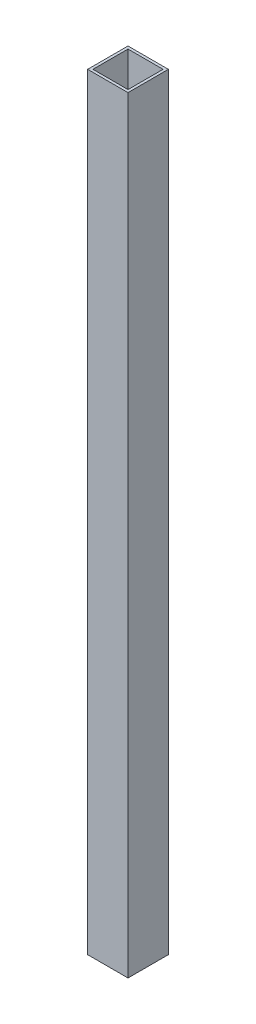
ISO-10303-21;
HEADER;
FILE_DESCRIPTION(('STEP AP214'),'2;1');
FILE_NAME('part.step','',(''),(''),'','','');
FILE_SCHEMA(('AUTOMOTIVE_DESIGN { 1 0 10303 214 1 1 1 1 }'));
ENDSEC;
DATA;
#1=APPLICATION_CONTEXT('core data for automotive mechanical design processes');
#2=APPLICATION_PROTOCOL_DEFINITION('international standard','automotive_design',2000,#1);
#3=PRODUCT_CONTEXT('',#1,'mechanical');
#4=PRODUCT('Part','Part','',(#3));
#5=PRODUCT_RELATED_PRODUCT_CATEGORY('part','',(#4));
#6=PRODUCT_DEFINITION_FORMATION('','',#4);
#7=PRODUCT_DEFINITION_CONTEXT('part definition',#1,'design');
#8=PRODUCT_DEFINITION('design','',#6,#7);
#9=PRODUCT_DEFINITION_SHAPE('','',#8);
#10=(LENGTH_UNIT() NAMED_UNIT(*) SI_UNIT(.MILLI.,.METRE.));
#11=(NAMED_UNIT(*) PLANE_ANGLE_UNIT() SI_UNIT($,.RADIAN.));
#12=(NAMED_UNIT(*) SI_UNIT($,.STERADIAN.) SOLID_ANGLE_UNIT());
#13=UNCERTAINTY_MEASURE_WITH_UNIT(LENGTH_MEASURE(1.E-05),#10,'distance_accuracy_value','');
#14=(GEOMETRIC_REPRESENTATION_CONTEXT(3) GLOBAL_UNCERTAINTY_ASSIGNED_CONTEXT((#13)) GLOBAL_UNIT_ASSIGNED_CONTEXT((#10,
#11,#12)) REPRESENTATION_CONTEXT('',''));
#15=CARTESIAN_POINT('',(0.,0.,0.));
#16=DIRECTION('',(0.,0.,1.));
#17=DIRECTION('',(1.,0.,0.));
#18=AXIS2_PLACEMENT_3D('',#15,#16,#17);
#19=CARTESIAN_POINT('',(0.,241.3,0.));
#20=DIRECTION('',(0.,1.,0.));
#21=DIRECTION('',(0.,0.,1.));
#22=AXIS2_PLACEMENT_3D('',#19,#20,#21);
#23=PLANE('',#22);
#24=DIRECTION('',(1.,0.,0.));
#25=VECTOR('',#24,1.);
#26=CARTESIAN_POINT('',(-12.7,241.3,-12.7));
#27=LINE('',#26,#25);
#28=CARTESIAN_POINT('',(-12.7,241.3,-12.7));
#29=VERTEX_POINT('',#28);
#30=CARTESIAN_POINT('',(12.7,241.3,-12.7));
#31=VERTEX_POINT('',#30);
#32=EDGE_CURVE('E137',#29,#31,#27,.T.);
#33=ORIENTED_EDGE('',*,*,#32,.F.);
#34=DIRECTION('',(0.,0.,-1.));
#35=VECTOR('',#34,1.);
#36=CARTESIAN_POINT('',(-12.7,241.3,12.7));
#37=LINE('',#36,#35);
#38=CARTESIAN_POINT('',(-12.7,241.3,12.7));
#39=VERTEX_POINT('',#38);
#40=EDGE_CURVE('E145',#39,#29,#37,.T.);
#41=ORIENTED_EDGE('',*,*,#40,.F.);
#42=DIRECTION('',(1.,0.,0.));
#43=VECTOR('',#42,1.);
#44=CARTESIAN_POINT('',(-12.7,241.3,12.7));
#45=LINE('',#44,#43);
#46=CARTESIAN_POINT('',(12.7,241.3,12.7));
#47=VERTEX_POINT('',#46);
#48=EDGE_CURVE('E143',#39,#47,#45,.T.);
#49=ORIENTED_EDGE('',*,*,#48,.T.);
#50=DIRECTION('',(0.,0.,-1.));
#51=VECTOR('',#50,1.);
#52=CARTESIAN_POINT('',(12.7,241.3,12.7));
#53=LINE('',#52,#51);
#54=EDGE_CURVE('E140',#47,#31,#53,.T.);
#55=ORIENTED_EDGE('',*,*,#54,.T.);
#56=EDGE_LOOP('',(#33,#41,#49,#55));
#57=FACE_BOUND('',#56,.T.);
#58=DIRECTION('',(0.,0.,-1.));
#59=VECTOR('',#58,1.);
#60=CARTESIAN_POINT('',(-11.049,241.3,11.049));
#61=LINE('',#60,#59);
#62=CARTESIAN_POINT('',(-11.049,241.3,11.049));
#63=VERTEX_POINT('',#62);
#64=CARTESIAN_POINT('',(-11.049,241.3,-11.049));
#65=VERTEX_POINT('',#64);
#66=EDGE_CURVE('E110',#63,#65,#61,.T.);
#67=ORIENTED_EDGE('',*,*,#66,.T.);
#68=DIRECTION('',(1.,0.,0.));
#69=VECTOR('',#68,1.);
#70=CARTESIAN_POINT('',(-11.049,241.3,-11.049));
#71=LINE('',#70,#69);
#72=CARTESIAN_POINT('',(11.049,241.3,-11.049));
#73=VERTEX_POINT('',#72);
#74=EDGE_CURVE('E52',#65,#73,#71,.T.);
#75=ORIENTED_EDGE('',*,*,#74,.T.);
#76=DIRECTION('',(0.,0.,-1.));
#77=VECTOR('',#76,1.);
#78=CARTESIAN_POINT('',(11.049,241.3,11.049));
#79=LINE('',#78,#77);
#80=CARTESIAN_POINT('',(11.049,241.3,11.049));
#81=VERTEX_POINT('',#80);
#82=EDGE_CURVE('E116',#81,#73,#79,.T.);
#83=ORIENTED_EDGE('',*,*,#82,.F.);
#84=DIRECTION('',(1.,0.,0.));
#85=VECTOR('',#84,1.);
#86=CARTESIAN_POINT('',(-11.049,241.3,11.049));
#87=LINE('',#86,#85);
#88=EDGE_CURVE('E128',#63,#81,#87,.T.);
#89=ORIENTED_EDGE('',*,*,#88,.F.);
#90=EDGE_LOOP('',(#67,#75,#83,#89));
#91=FACE_BOUND('',#90,.T.);
#92=ADVANCED_FACE('F35',(#57,#91),#23,.T.);
#93=CARTESIAN_POINT('',(0.,-241.3,0.));
#94=DIRECTION('',(0.,1.,0.));
#95=DIRECTION('',(0.,0.,1.));
#96=AXIS2_PLACEMENT_3D('',#93,#94,#95);
#97=PLANE('',#96);
#98=DIRECTION('',(1.,0.,0.));
#99=VECTOR('',#98,1.);
#100=CARTESIAN_POINT('',(-12.7,-241.3,-12.7));
#101=LINE('',#100,#99);
#102=CARTESIAN_POINT('',(-12.7,-241.3,-12.7));
#103=VERTEX_POINT('',#102);
#104=CARTESIAN_POINT('',(12.7,-241.3,-12.7));
#105=VERTEX_POINT('',#104);
#106=EDGE_CURVE('E117',#103,#105,#101,.T.);
#107=ORIENTED_EDGE('',*,*,#106,.T.);
#108=DIRECTION('',(0.,0.,-1.));
#109=VECTOR('',#108,1.);
#110=CARTESIAN_POINT('',(12.7,-241.3,12.7));
#111=LINE('',#110,#109);
#112=CARTESIAN_POINT('',(12.7,-241.3,12.7));
#113=VERTEX_POINT('',#112);
#114=EDGE_CURVE('E150',#113,#105,#111,.T.);
#115=ORIENTED_EDGE('',*,*,#114,.F.);
#116=DIRECTION('',(1.,0.,0.));
#117=VECTOR('',#116,1.);
#118=CARTESIAN_POINT('',(-12.7,-241.3,12.7));
#119=LINE('',#118,#117);
#120=CARTESIAN_POINT('',(-12.7,-241.3,12.7));
#121=VERTEX_POINT('',#120);
#122=EDGE_CURVE('E153',#121,#113,#119,.T.);
#123=ORIENTED_EDGE('',*,*,#122,.F.);
#124=DIRECTION('',(0.,0.,-1.));
#125=VECTOR('',#124,1.);
#126=CARTESIAN_POINT('',(-12.7,-241.3,12.7));
#127=LINE('',#126,#125);
#128=EDGE_CURVE('E141',#121,#103,#127,.T.);
#129=ORIENTED_EDGE('',*,*,#128,.T.);
#130=EDGE_LOOP('',(#107,#115,#123,#129));
#131=FACE_BOUND('',#130,.T.);
#132=DIRECTION('',(1.,0.,0.));
#133=VECTOR('',#132,1.);
#134=CARTESIAN_POINT('',(-11.049,-241.3,-11.049));
#135=LINE('',#134,#133);
#136=CARTESIAN_POINT('',(-11.049,-241.3,-11.049));
#137=VERTEX_POINT('',#136);
#138=CARTESIAN_POINT('',(11.049,-241.3,-11.049));
#139=VERTEX_POINT('',#138);
#140=EDGE_CURVE('E100',#137,#139,#135,.T.);
#141=ORIENTED_EDGE('',*,*,#140,.F.);
#142=DIRECTION('',(0.,0.,-1.));
#143=VECTOR('',#142,1.);
#144=CARTESIAN_POINT('',(-11.049,-241.3,11.049));
#145=LINE('',#144,#143);
#146=CARTESIAN_POINT('',(-11.049,-241.3,11.049));
#147=VERTEX_POINT('',#146);
#148=EDGE_CURVE('E122',#147,#137,#145,.T.);
#149=ORIENTED_EDGE('',*,*,#148,.F.);
#150=DIRECTION('',(1.,0.,0.));
#151=VECTOR('',#150,1.);
#152=CARTESIAN_POINT('',(-11.049,-241.3,11.049));
#153=LINE('',#152,#151);
#154=CARTESIAN_POINT('',(11.049,-241.3,11.049));
#155=VERTEX_POINT('',#154);
#156=EDGE_CURVE('E60',#147,#155,#153,.T.);
#157=ORIENTED_EDGE('',*,*,#156,.T.);
#158=DIRECTION('',(0.,0.,-1.));
#159=VECTOR('',#158,1.);
#160=CARTESIAN_POINT('',(11.049,-241.3,11.049));
#161=LINE('',#160,#159);
#162=EDGE_CURVE('E109',#155,#139,#161,.T.);
#163=ORIENTED_EDGE('',*,*,#162,.T.);
#164=EDGE_LOOP('',(#141,#149,#157,#163));
#165=FACE_BOUND('',#164,.T.);
#166=ADVANCED_FACE('F120',(#131,#165),#97,.F.);
#167=CARTESIAN_POINT('',(-12.7,241.3,-12.7));
#168=DIRECTION('',(0.,0.,-1.));
#169=DIRECTION('',(-1.,0.,0.));
#170=AXIS2_PLACEMENT_3D('',#167,#168,#169);
#171=PLANE('',#170);
#172=ORIENTED_EDGE('',*,*,#106,.F.);
#173=DIRECTION('',(0.,-1.,0.));
#174=VECTOR('',#173,1.);
#175=CARTESIAN_POINT('',(-12.7,241.3,-12.7));
#176=LINE('',#175,#174);
#177=EDGE_CURVE('E11',#29,#103,#176,.T.);
#178=ORIENTED_EDGE('',*,*,#177,.F.);
#179=ORIENTED_EDGE('',*,*,#32,.T.);
#180=DIRECTION('',(0.,-1.,0.));
#181=VECTOR('',#180,1.);
#182=CARTESIAN_POINT('',(12.7,241.3,-12.7));
#183=LINE('',#182,#181);
#184=EDGE_CURVE('E39',#31,#105,#183,.T.);
#185=ORIENTED_EDGE('',*,*,#184,.T.);
#186=EDGE_LOOP('',(#172,#178,#179,#185));
#187=FACE_BOUND('',#186,.T.);
#188=ADVANCED_FACE('F37',(#187),#171,.T.);
#189=CARTESIAN_POINT('',(-12.7,241.3,12.7));
#190=DIRECTION('',(-1.,0.,0.));
#191=DIRECTION('',(0.,0.,1.));
#192=AXIS2_PLACEMENT_3D('',#189,#190,#191);
#193=PLANE('',#192);
#194=ORIENTED_EDGE('',*,*,#128,.F.);
#195=DIRECTION('',(0.,-1.,0.));
#196=VECTOR('',#195,1.);
#197=CARTESIAN_POINT('',(-12.7,241.3,12.7));
#198=LINE('',#197,#196);
#199=EDGE_CURVE('E44',#39,#121,#198,.T.);
#200=ORIENTED_EDGE('',*,*,#199,.F.);
#201=ORIENTED_EDGE('',*,*,#40,.T.);
#202=ORIENTED_EDGE('',*,*,#177,.T.);
#203=EDGE_LOOP('',(#194,#200,#201,#202));
#204=FACE_BOUND('',#203,.T.);
#205=ADVANCED_FACE('F172',(#204),#193,.T.);
#206=CARTESIAN_POINT('',(-12.7,241.3,12.7));
#207=DIRECTION('',(0.,0.,-1.));
#208=DIRECTION('',(-1.,0.,0.));
#209=AXIS2_PLACEMENT_3D('',#206,#207,#208);
#210=PLANE('',#209);
#211=ORIENTED_EDGE('',*,*,#122,.T.);
#212=DIRECTION('',(0.,-1.,0.));
#213=VECTOR('',#212,1.);
#214=CARTESIAN_POINT('',(12.7,241.3,12.7));
#215=LINE('',#214,#213);
#216=EDGE_CURVE('E157',#47,#113,#215,.T.);
#217=ORIENTED_EDGE('',*,*,#216,.F.);
#218=ORIENTED_EDGE('',*,*,#48,.F.);
#219=ORIENTED_EDGE('',*,*,#199,.T.);
#220=EDGE_LOOP('',(#211,#217,#218,#219));
#221=FACE_BOUND('',#220,.T.);
#222=ADVANCED_FACE('F178',(#221),#210,.F.);
#223=CARTESIAN_POINT('',(12.7,241.3,12.7));
#224=DIRECTION('',(-1.,0.,0.));
#225=DIRECTION('',(0.,0.,1.));
#226=AXIS2_PLACEMENT_3D('',#223,#224,#225);
#227=PLANE('',#226);
#228=ORIENTED_EDGE('',*,*,#114,.T.);
#229=ORIENTED_EDGE('',*,*,#184,.F.);
#230=ORIENTED_EDGE('',*,*,#54,.F.);
#231=ORIENTED_EDGE('',*,*,#216,.T.);
#232=EDGE_LOOP('',(#228,#229,#230,#231));
#233=FACE_BOUND('',#232,.T.);
#234=ADVANCED_FACE('F167',(#233),#227,.F.);
#235=CARTESIAN_POINT('',(-11.049,-241.3,-11.049));
#236=DIRECTION('',(0.,0.,1.));
#237=DIRECTION('',(1.,0.,0.));
#238=AXIS2_PLACEMENT_3D('',#235,#236,#237);
#239=PLANE('',#238);
#240=ORIENTED_EDGE('',*,*,#74,.F.);
#241=DIRECTION('',(0.,1.,0.));
#242=VECTOR('',#241,1.);
#243=CARTESIAN_POINT('',(-11.049,-241.3,-11.049));
#244=LINE('',#243,#242);
#245=EDGE_CURVE('E105',#137,#65,#244,.T.);
#246=ORIENTED_EDGE('',*,*,#245,.F.);
#247=ORIENTED_EDGE('',*,*,#140,.T.);
#248=DIRECTION('',(0.,1.,0.));
#249=VECTOR('',#248,1.);
#250=CARTESIAN_POINT('',(11.049,-241.3,-11.049));
#251=LINE('',#250,#249);
#252=EDGE_CURVE('E103',#139,#73,#251,.T.);
#253=ORIENTED_EDGE('',*,*,#252,.T.);
#254=EDGE_LOOP('',(#240,#246,#247,#253));
#255=FACE_BOUND('',#254,.T.);
#256=ADVANCED_FACE('F102',(#255),#239,.T.);
#257=CARTESIAN_POINT('',(11.049,-241.3,11.049));
#258=DIRECTION('',(1.,0.,0.));
#259=DIRECTION('',(0.,0.,-1.));
#260=AXIS2_PLACEMENT_3D('',#257,#258,#259);
#261=PLANE('',#260);
#262=ORIENTED_EDGE('',*,*,#82,.T.);
#263=ORIENTED_EDGE('',*,*,#252,.F.);
#264=ORIENTED_EDGE('',*,*,#162,.F.);
#265=DIRECTION('',(0.,1.,0.));
#266=VECTOR('',#265,1.);
#267=CARTESIAN_POINT('',(11.049,-241.3,11.049));
#268=LINE('',#267,#266);
#269=EDGE_CURVE('E118',#155,#81,#268,.T.);
#270=ORIENTED_EDGE('',*,*,#269,.T.);
#271=EDGE_LOOP('',(#262,#263,#264,#270));
#272=FACE_BOUND('',#271,.T.);
#273=ADVANCED_FACE('F114',(#272),#261,.F.);
#274=CARTESIAN_POINT('',(-11.049,-241.3,11.049));
#275=DIRECTION('',(0.,0.,1.));
#276=DIRECTION('',(1.,0.,0.));
#277=AXIS2_PLACEMENT_3D('',#274,#275,#276);
#278=PLANE('',#277);
#279=ORIENTED_EDGE('',*,*,#88,.T.);
#280=ORIENTED_EDGE('',*,*,#269,.F.);
#281=ORIENTED_EDGE('',*,*,#156,.F.);
#282=DIRECTION('',(0.,1.,0.));
#283=VECTOR('',#282,1.);
#284=CARTESIAN_POINT('',(-11.049,-241.3,11.049));
#285=LINE('',#284,#283);
#286=EDGE_CURVE('E134',#147,#63,#285,.T.);
#287=ORIENTED_EDGE('',*,*,#286,.T.);
#288=EDGE_LOOP('',(#279,#280,#281,#287));
#289=FACE_BOUND('',#288,.T.);
#290=ADVANCED_FACE('F197',(#289),#278,.F.);
#291=CARTESIAN_POINT('',(-11.049,-241.3,11.049));
#292=DIRECTION('',(1.,0.,0.));
#293=DIRECTION('',(0.,0.,-1.));
#294=AXIS2_PLACEMENT_3D('',#291,#292,#293);
#295=PLANE('',#294);
#296=ORIENTED_EDGE('',*,*,#66,.F.);
#297=ORIENTED_EDGE('',*,*,#286,.F.);
#298=ORIENTED_EDGE('',*,*,#148,.T.);
#299=ORIENTED_EDGE('',*,*,#245,.T.);
#300=EDGE_LOOP('',(#296,#297,#298,#299));
#301=FACE_BOUND('',#300,.T.);
#302=ADVANCED_FACE('F200',(#301),#295,.T.);
#303=CLOSED_SHELL('',(#92,#166,#188,#205,#222,#234,#256,#273,#290,#302));
#304=MANIFOLD_SOLID_BREP('B2',#303);
#305=ADVANCED_BREP_SHAPE_REPRESENTATION('',(#18,#304),#14);
#306=SHAPE_DEFINITION_REPRESENTATION(#9,#305);
ENDSEC;
END-ISO-10303-21;
